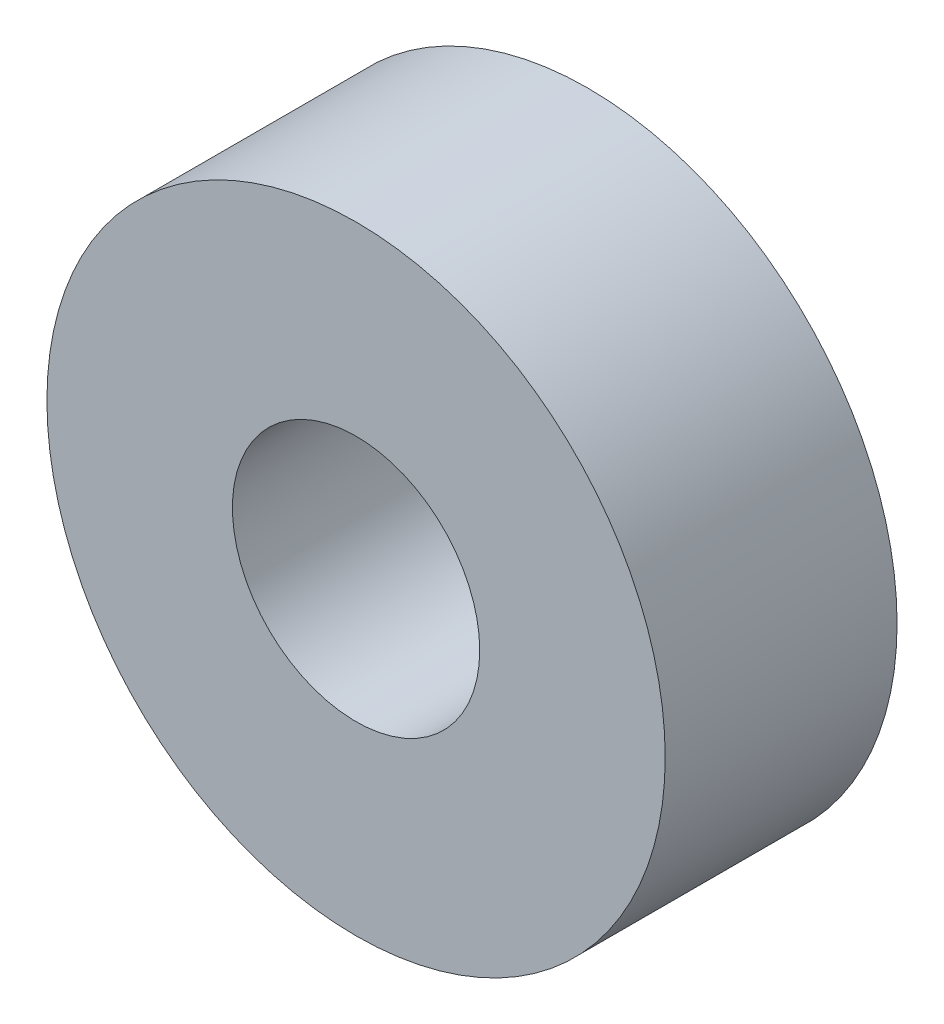
ISO-10303-21;
HEADER;
FILE_DESCRIPTION(('STEP AP214'),'2;1');
FILE_NAME('part.step','',(''),(''),'','','');
FILE_SCHEMA(('AUTOMOTIVE_DESIGN { 1 0 10303 214 1 1 1 1 }'));
ENDSEC;
DATA;
#1=APPLICATION_CONTEXT('core data for automotive mechanical design processes');
#2=APPLICATION_PROTOCOL_DEFINITION('international standard','automotive_design',2000,#1);
#3=PRODUCT_CONTEXT('',#1,'mechanical');
#4=PRODUCT('Part','Part','',(#3));
#5=PRODUCT_RELATED_PRODUCT_CATEGORY('part','',(#4));
#6=PRODUCT_DEFINITION_FORMATION('','',#4);
#7=PRODUCT_DEFINITION_CONTEXT('part definition',#1,'design');
#8=PRODUCT_DEFINITION('design','',#6,#7);
#9=PRODUCT_DEFINITION_SHAPE('','',#8);
#10=(LENGTH_UNIT() NAMED_UNIT(*) SI_UNIT(.MILLI.,.METRE.));
#11=(NAMED_UNIT(*) PLANE_ANGLE_UNIT() SI_UNIT($,.RADIAN.));
#12=(NAMED_UNIT(*) SI_UNIT($,.STERADIAN.) SOLID_ANGLE_UNIT());
#13=UNCERTAINTY_MEASURE_WITH_UNIT(LENGTH_MEASURE(1.E-05),#10,'distance_accuracy_value','');
#14=(GEOMETRIC_REPRESENTATION_CONTEXT(3) GLOBAL_UNCERTAINTY_ASSIGNED_CONTEXT((#13)) GLOBAL_UNIT_ASSIGNED_CONTEXT((#10,
#11,#12)) REPRESENTATION_CONTEXT('',''));
#15=CARTESIAN_POINT('',(0.,0.,0.));
#16=DIRECTION('',(0.,0.,1.));
#17=DIRECTION('',(1.,0.,0.));
#18=AXIS2_PLACEMENT_3D('',#15,#16,#17);
#19=CARTESIAN_POINT('',(0.,0.,1.5));
#20=DIRECTION('',(0.,0.,1.));
#21=DIRECTION('',(1.,0.,0.));
#22=AXIS2_PLACEMENT_3D('',#19,#20,#21);
#23=PLANE('',#22);
#24=CARTESIAN_POINT('',(0.,0.,1.5));
#25=DIRECTION('',(0.,0.,1.));
#26=DIRECTION('',(1.,0.,0.));
#27=AXIS2_PLACEMENT_3D('',#24,#25,#26);
#28=CIRCLE('',#27,4.);
#29=CARTESIAN_POINT('',(4.,0.,1.5));
#30=VERTEX_POINT('',#29);
#31=EDGE_CURVE('E10',#30,#30,#28,.T.);
#32=ORIENTED_EDGE('',*,*,#31,.T.);
#33=EDGE_LOOP('',(#32));
#34=FACE_BOUND('',#33,.T.);
#35=CARTESIAN_POINT('',(0.,0.,1.5));
#36=DIRECTION('',(0.,0.,1.));
#37=DIRECTION('',(1.,0.,0.));
#38=AXIS2_PLACEMENT_3D('',#35,#36,#37);
#39=CIRCLE('',#38,1.6);
#40=CARTESIAN_POINT('',(1.6,0.,1.5));
#41=VERTEX_POINT('',#40);
#42=EDGE_CURVE('E37',#41,#41,#39,.T.);
#43=ORIENTED_EDGE('',*,*,#42,.F.);
#44=EDGE_LOOP('',(#43));
#45=FACE_BOUND('',#44,.T.);
#46=ADVANCED_FACE('F30',(#34,#45),#23,.T.);
#47=CARTESIAN_POINT('',(0.,0.,1.5));
#48=DIRECTION('',(0.,0.,-1.));
#49=DIRECTION('',(-1.,0.,0.));
#50=AXIS2_PLACEMENT_3D('',#47,#48,#49);
#51=CYLINDRICAL_SURFACE('',#50,4.);
#52=ORIENTED_EDGE('',*,*,#31,.F.);
#53=EDGE_LOOP('',(#52));
#54=FACE_BOUND('',#53,.T.);
#55=CARTESIAN_POINT('',(0.,0.,-1.5));
#56=DIRECTION('',(0.,0.,1.));
#57=DIRECTION('',(1.,0.,0.));
#58=AXIS2_PLACEMENT_3D('',#55,#56,#57);
#59=CIRCLE('',#58,4.);
#60=CARTESIAN_POINT('',(4.,0.,-1.5));
#61=VERTEX_POINT('',#60);
#62=EDGE_CURVE('E41',#61,#61,#59,.T.);
#63=ORIENTED_EDGE('',*,*,#62,.T.);
#64=EDGE_LOOP('',(#63));
#65=FACE_BOUND('',#64,.T.);
#66=ADVANCED_FACE('F32',(#54,#65),#51,.T.);
#67=CARTESIAN_POINT('',(0.,0.,1.5));
#68=DIRECTION('',(0.,0.,-1.));
#69=DIRECTION('',(-1.,0.,0.));
#70=AXIS2_PLACEMENT_3D('',#67,#68,#69);
#71=CYLINDRICAL_SURFACE('',#70,1.6);
#72=ORIENTED_EDGE('',*,*,#42,.T.);
#73=EDGE_LOOP('',(#72));
#74=FACE_BOUND('',#73,.T.);
#75=CARTESIAN_POINT('',(0.,0.,-1.5));
#76=DIRECTION('',(0.,0.,1.));
#77=DIRECTION('',(1.,0.,0.));
#78=AXIS2_PLACEMENT_3D('',#75,#76,#77);
#79=CIRCLE('',#78,1.6);
#80=CARTESIAN_POINT('',(1.6,0.,-1.5));
#81=VERTEX_POINT('',#80);
#82=EDGE_CURVE('E45',#81,#81,#79,.T.);
#83=ORIENTED_EDGE('',*,*,#82,.F.);
#84=EDGE_LOOP('',(#83));
#85=FACE_BOUND('',#84,.T.);
#86=ADVANCED_FACE('F54',(#74,#85),#71,.F.);
#87=CARTESIAN_POINT('',(0.,0.,-1.5));
#88=DIRECTION('',(0.,0.,1.));
#89=DIRECTION('',(1.,0.,0.));
#90=AXIS2_PLACEMENT_3D('',#87,#88,#89);
#91=PLANE('',#90);
#92=ORIENTED_EDGE('',*,*,#82,.T.);
#93=EDGE_LOOP('',(#92));
#94=FACE_BOUND('',#93,.T.);
#95=ORIENTED_EDGE('',*,*,#62,.F.);
#96=EDGE_LOOP('',(#95));
#97=FACE_BOUND('',#96,.T.);
#98=ADVANCED_FACE('F51',(#94,#97),#91,.F.);
#99=CLOSED_SHELL('',(#46,#66,#86,#98));
#100=MANIFOLD_SOLID_BREP('B2',#99);
#101=ADVANCED_BREP_SHAPE_REPRESENTATION('',(#18,#100),#14);
#102=SHAPE_DEFINITION_REPRESENTATION(#9,#101);
ENDSEC;
END-ISO-10303-21;
